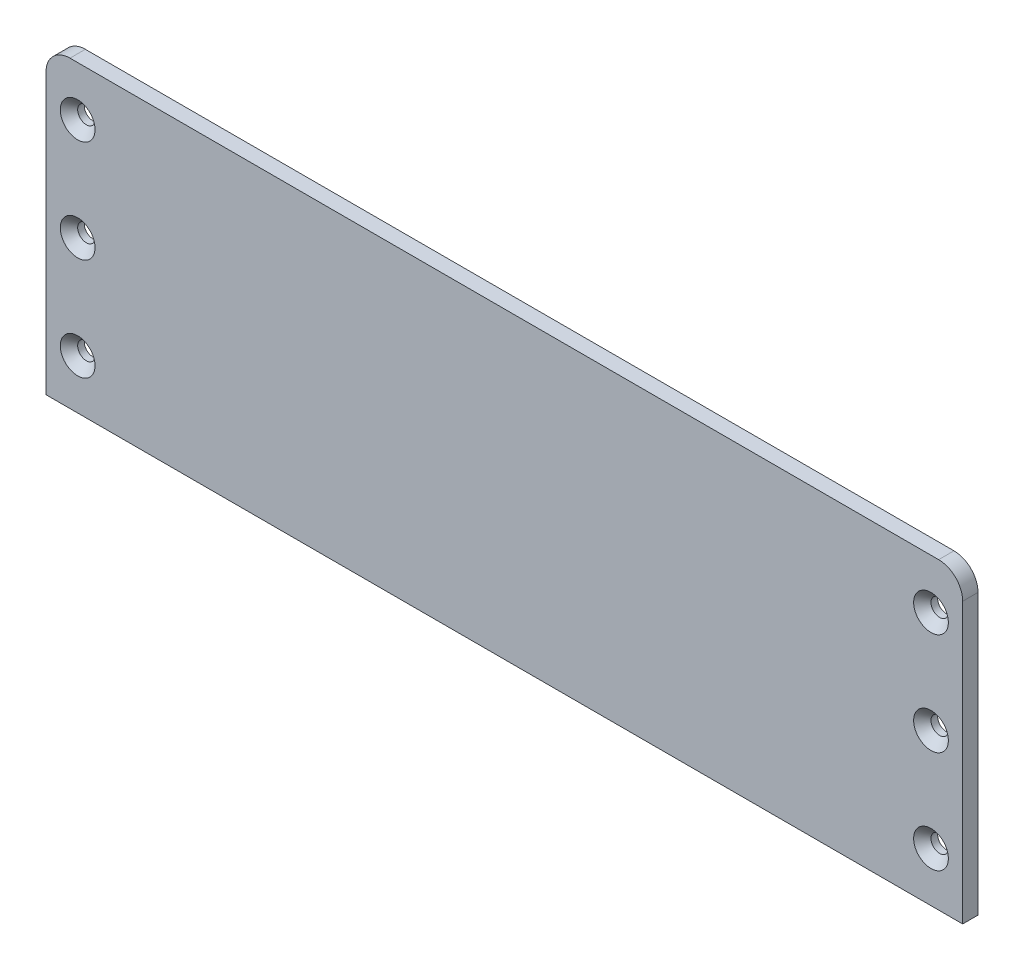
ISO-10303-21;
HEADER;
FILE_DESCRIPTION(('STEP AP214'),'2;1');
FILE_NAME('part.step','',(''),(''),'','','');
FILE_SCHEMA(('AUTOMOTIVE_DESIGN { 1 0 10303 214 1 1 1 1 }'));
ENDSEC;
DATA;
#1=APPLICATION_CONTEXT('core data for automotive mechanical design processes');
#2=APPLICATION_PROTOCOL_DEFINITION('international standard','automotive_design',2000,#1);
#3=PRODUCT_CONTEXT('',#1,'mechanical');
#4=PRODUCT('Part','Part','',(#3));
#5=PRODUCT_RELATED_PRODUCT_CATEGORY('part','',(#4));
#6=PRODUCT_DEFINITION_FORMATION('','',#4);
#7=PRODUCT_DEFINITION_CONTEXT('part definition',#1,'design');
#8=PRODUCT_DEFINITION('design','',#6,#7);
#9=PRODUCT_DEFINITION_SHAPE('','',#8);
#10=(LENGTH_UNIT() NAMED_UNIT(*) SI_UNIT(.MILLI.,.METRE.));
#11=(NAMED_UNIT(*) PLANE_ANGLE_UNIT() SI_UNIT($,.RADIAN.));
#12=(NAMED_UNIT(*) SI_UNIT($,.STERADIAN.) SOLID_ANGLE_UNIT());
#13=UNCERTAINTY_MEASURE_WITH_UNIT(LENGTH_MEASURE(1.E-05),#10,'distance_accuracy_value','');
#14=(GEOMETRIC_REPRESENTATION_CONTEXT(3) GLOBAL_UNCERTAINTY_ASSIGNED_CONTEXT((#13)) GLOBAL_UNIT_ASSIGNED_CONTEXT((#10,
#11,#12)) REPRESENTATION_CONTEXT('',''));
#15=CARTESIAN_POINT('',(0.,0.,0.));
#16=DIRECTION('',(0.,0.,1.));
#17=DIRECTION('',(1.,0.,0.));
#18=AXIS2_PLACEMENT_3D('',#15,#16,#17);
#19=CARTESIAN_POINT('',(0.,0.,3.));
#20=DIRECTION('',(0.,0.,-1.));
#21=DIRECTION('',(-1.,0.,0.));
#22=AXIS2_PLACEMENT_3D('',#19,#20,#21);
#23=PLANE('',#22);
#24=CARTESIAN_POINT('',(83.5,-20.,3.));
#25=DIRECTION('',(0.,0.,1.));
#26=DIRECTION('',(1.,0.,0.));
#27=AXIS2_PLACEMENT_3D('',#24,#25,#26);
#28=CIRCLE('',#27,3.4);
#29=CARTESIAN_POINT('',(86.9,-20.,3.));
#30=VERTEX_POINT('',#29);
#31=EDGE_CURVE('E189',#30,#30,#28,.T.);
#32=ORIENTED_EDGE('',*,*,#31,.F.);
#33=EDGE_LOOP('',(#32));
#34=FACE_BOUND('',#33,.T.);
#35=CARTESIAN_POINT('',(83.5,0.,3.));
#36=DIRECTION('',(0.,0.,1.));
#37=DIRECTION('',(1.,0.,0.));
#38=AXIS2_PLACEMENT_3D('',#35,#36,#37);
#39=CIRCLE('',#38,3.4);
#40=CARTESIAN_POINT('',(86.9,0.,3.));
#41=VERTEX_POINT('',#40);
#42=EDGE_CURVE('E180',#41,#41,#39,.T.);
#43=ORIENTED_EDGE('',*,*,#42,.F.);
#44=EDGE_LOOP('',(#43));
#45=FACE_BOUND('',#44,.T.);
#46=CARTESIAN_POINT('',(83.5,20.,3.));
#47=DIRECTION('',(0.,0.,1.));
#48=DIRECTION('',(1.,0.,0.));
#49=AXIS2_PLACEMENT_3D('',#46,#47,#48);
#50=CIRCLE('',#49,3.4);
#51=CARTESIAN_POINT('',(86.9,20.,3.));
#52=VERTEX_POINT('',#51);
#53=EDGE_CURVE('E171',#52,#52,#50,.T.);
#54=ORIENTED_EDGE('',*,*,#53,.F.);
#55=EDGE_LOOP('',(#54));
#56=FACE_BOUND('',#55,.T.);
#57=CARTESIAN_POINT('',(-83.5,-20.,3.));
#58=DIRECTION('',(0.,0.,1.));
#59=DIRECTION('',(1.,0.,0.));
#60=AXIS2_PLACEMENT_3D('',#57,#58,#59);
#61=CIRCLE('',#60,3.4);
#62=CARTESIAN_POINT('',(-80.1,-20.,3.));
#63=VERTEX_POINT('',#62);
#64=EDGE_CURVE('E162',#63,#63,#61,.T.);
#65=ORIENTED_EDGE('',*,*,#64,.F.);
#66=EDGE_LOOP('',(#65));
#67=FACE_BOUND('',#66,.T.);
#68=CARTESIAN_POINT('',(-83.5,0.,3.));
#69=DIRECTION('',(0.,0.,1.));
#70=DIRECTION('',(1.,0.,0.));
#71=AXIS2_PLACEMENT_3D('',#68,#69,#70);
#72=CIRCLE('',#71,3.4);
#73=CARTESIAN_POINT('',(-80.1,0.,3.));
#74=VERTEX_POINT('',#73);
#75=EDGE_CURVE('E153',#74,#74,#72,.T.);
#76=ORIENTED_EDGE('',*,*,#75,.F.);
#77=EDGE_LOOP('',(#76));
#78=FACE_BOUND('',#77,.T.);
#79=CARTESIAN_POINT('',(-83.5,20.,3.));
#80=DIRECTION('',(0.,0.,1.));
#81=DIRECTION('',(1.,0.,0.));
#82=AXIS2_PLACEMENT_3D('',#79,#80,#81);
#83=CIRCLE('',#82,3.4);
#84=CARTESIAN_POINT('',(-80.1,20.,3.));
#85=VERTEX_POINT('',#84);
#86=EDGE_CURVE('E107',#85,#85,#83,.T.);
#87=ORIENTED_EDGE('',*,*,#86,.F.);
#88=EDGE_LOOP('',(#87));
#89=FACE_BOUND('',#88,.T.);
#90=CARTESIAN_POINT('',(85.,25.,3.));
#91=DIRECTION('',(0.,0.,1.));
#92=DIRECTION('',(1.,0.,0.));
#93=AXIS2_PLACEMENT_3D('',#90,#91,#92);
#94=CIRCLE('',#93,4.7);
#95=CARTESIAN_POINT('',(89.7,25.,3.));
#96=VERTEX_POINT('',#95);
#97=CARTESIAN_POINT('',(84.9999999999999,29.7,3.));
#98=VERTEX_POINT('',#97);
#99=EDGE_CURVE('E123',#96,#98,#94,.T.);
#100=ORIENTED_EDGE('',*,*,#99,.T.);
#101=DIRECTION('',(-1.,0.,0.));
#102=VECTOR('',#101,1.);
#103=CARTESIAN_POINT('',(84.9999999999999,29.7,3.));
#104=LINE('',#103,#102);
#105=CARTESIAN_POINT('',(-85.,29.7,3.));
#106=VERTEX_POINT('',#105);
#107=EDGE_CURVE('E126',#98,#106,#104,.T.);
#108=ORIENTED_EDGE('',*,*,#107,.T.);
#109=CARTESIAN_POINT('',(-85.,25.,3.));
#110=DIRECTION('',(0.,0.,1.));
#111=DIRECTION('',(1.,0.,0.));
#112=AXIS2_PLACEMENT_3D('',#109,#110,#111);
#113=CIRCLE('',#112,4.69999999999999);
#114=CARTESIAN_POINT('',(-89.7,25.,3.));
#115=VERTEX_POINT('',#114);
#116=EDGE_CURVE('E55',#106,#115,#113,.T.);
#117=ORIENTED_EDGE('',*,*,#116,.T.);
#118=DIRECTION('',(0.,-1.,0.));
#119=VECTOR('',#118,1.);
#120=CARTESIAN_POINT('',(-89.7,25.,3.));
#121=LINE('',#120,#119);
#122=CARTESIAN_POINT('',(-89.7,-29.7,3.));
#123=VERTEX_POINT('',#122);
#124=EDGE_CURVE('E129',#115,#123,#121,.T.);
#125=ORIENTED_EDGE('',*,*,#124,.T.);
#126=DIRECTION('',(1.,0.,0.));
#127=VECTOR('',#126,1.);
#128=CARTESIAN_POINT('',(-89.7,-29.7,3.));
#129=LINE('',#128,#127);
#130=CARTESIAN_POINT('',(89.7,-29.7,3.));
#131=VERTEX_POINT('',#130);
#132=EDGE_CURVE('E132',#123,#131,#129,.T.);
#133=ORIENTED_EDGE('',*,*,#132,.T.);
#134=DIRECTION('',(0.,1.,0.));
#135=VECTOR('',#134,1.);
#136=CARTESIAN_POINT('',(89.7,-29.7,3.));
#137=LINE('',#136,#135);
#138=EDGE_CURVE('E135',#131,#96,#137,.T.);
#139=ORIENTED_EDGE('',*,*,#138,.T.);
#140=EDGE_LOOP('',(#100,#108,#117,#125,#133,#139));
#141=FACE_BOUND('',#140,.T.);
#142=ADVANCED_FACE('F40',(#34,#45,#56,#67,#78,#89,#141),#23,.F.);
#143=CARTESIAN_POINT('',(0.,0.,0.));
#144=DIRECTION('',(0.,0.,-1.));
#145=DIRECTION('',(-1.,0.,0.));
#146=AXIS2_PLACEMENT_3D('',#143,#144,#145);
#147=PLANE('',#146);
#148=CARTESIAN_POINT('',(83.5,-20.,0.));
#149=DIRECTION('',(0.,0.,1.));
#150=DIRECTION('',(1.,0.,0.));
#151=AXIS2_PLACEMENT_3D('',#148,#149,#150);
#152=CIRCLE('',#151,1.69999999999999);
#153=CARTESIAN_POINT('',(85.2,-20.,0.));
#154=VERTEX_POINT('',#153);
#155=EDGE_CURVE('E11',#154,#154,#152,.T.);
#156=ORIENTED_EDGE('',*,*,#155,.T.);
#157=EDGE_LOOP('',(#156));
#158=FACE_BOUND('',#157,.T.);
#159=CARTESIAN_POINT('',(83.5,0.,0.));
#160=DIRECTION('',(0.,0.,1.));
#161=DIRECTION('',(1.,0.,0.));
#162=AXIS2_PLACEMENT_3D('',#159,#160,#161);
#163=CIRCLE('',#162,1.69999999999999);
#164=CARTESIAN_POINT('',(85.2,0.,0.));
#165=VERTEX_POINT('',#164);
#166=EDGE_CURVE('E186',#165,#165,#163,.T.);
#167=ORIENTED_EDGE('',*,*,#166,.T.);
#168=EDGE_LOOP('',(#167));
#169=FACE_BOUND('',#168,.T.);
#170=CARTESIAN_POINT('',(83.5,20.,0.));
#171=DIRECTION('',(0.,0.,1.));
#172=DIRECTION('',(1.,0.,0.));
#173=AXIS2_PLACEMENT_3D('',#170,#171,#172);
#174=CIRCLE('',#173,1.69999999999999);
#175=CARTESIAN_POINT('',(85.2,20.,0.));
#176=VERTEX_POINT('',#175);
#177=EDGE_CURVE('E177',#176,#176,#174,.T.);
#178=ORIENTED_EDGE('',*,*,#177,.T.);
#179=EDGE_LOOP('',(#178));
#180=FACE_BOUND('',#179,.T.);
#181=CARTESIAN_POINT('',(-83.5,-20.,0.));
#182=DIRECTION('',(0.,0.,1.));
#183=DIRECTION('',(1.,0.,0.));
#184=AXIS2_PLACEMENT_3D('',#181,#182,#183);
#185=CIRCLE('',#184,1.69999999999999);
#186=CARTESIAN_POINT('',(-81.8,-20.,0.));
#187=VERTEX_POINT('',#186);
#188=EDGE_CURVE('E168',#187,#187,#185,.T.);
#189=ORIENTED_EDGE('',*,*,#188,.T.);
#190=EDGE_LOOP('',(#189));
#191=FACE_BOUND('',#190,.T.);
#192=CARTESIAN_POINT('',(-83.5,0.,0.));
#193=DIRECTION('',(0.,0.,1.));
#194=DIRECTION('',(1.,0.,0.));
#195=AXIS2_PLACEMENT_3D('',#192,#193,#194);
#196=CIRCLE('',#195,1.69999999999999);
#197=CARTESIAN_POINT('',(-81.8,0.,0.));
#198=VERTEX_POINT('',#197);
#199=EDGE_CURVE('E159',#198,#198,#196,.T.);
#200=ORIENTED_EDGE('',*,*,#199,.T.);
#201=EDGE_LOOP('',(#200));
#202=FACE_BOUND('',#201,.T.);
#203=CARTESIAN_POINT('',(-83.5,20.,0.));
#204=DIRECTION('',(0.,0.,1.));
#205=DIRECTION('',(1.,0.,0.));
#206=AXIS2_PLACEMENT_3D('',#203,#204,#205);
#207=CIRCLE('',#206,1.69999999999999);
#208=CARTESIAN_POINT('',(-81.8,20.,0.));
#209=VERTEX_POINT('',#208);
#210=EDGE_CURVE('E150',#209,#209,#207,.T.);
#211=ORIENTED_EDGE('',*,*,#210,.T.);
#212=EDGE_LOOP('',(#211));
#213=FACE_BOUND('',#212,.T.);
#214=DIRECTION('',(-1.,0.,0.));
#215=VECTOR('',#214,1.);
#216=CARTESIAN_POINT('',(84.9999999999999,29.7,0.));
#217=LINE('',#216,#215);
#218=CARTESIAN_POINT('',(84.9999999999999,29.7,0.));
#219=VERTEX_POINT('',#218);
#220=CARTESIAN_POINT('',(-85.,29.7,0.));
#221=VERTEX_POINT('',#220);
#222=EDGE_CURVE('E104',#219,#221,#217,.T.);
#223=ORIENTED_EDGE('',*,*,#222,.F.);
#224=CARTESIAN_POINT('',(85.,25.,0.));
#225=DIRECTION('',(0.,0.,-1.));
#226=DIRECTION('',(-1.,0.,0.));
#227=AXIS2_PLACEMENT_3D('',#224,#225,#226);
#228=CIRCLE('',#227,4.7);
#229=CARTESIAN_POINT('',(89.7,25.,0.));
#230=VERTEX_POINT('',#229);
#231=EDGE_CURVE('E63',#230,#219,#228,.F.);
#232=ORIENTED_EDGE('',*,*,#231,.F.);
#233=DIRECTION('',(0.,1.,0.));
#234=VECTOR('',#233,1.);
#235=CARTESIAN_POINT('',(89.7,-29.7,0.));
#236=LINE('',#235,#234);
#237=CARTESIAN_POINT('',(89.7,-29.7,0.));
#238=VERTEX_POINT('',#237);
#239=EDGE_CURVE('E119',#238,#230,#236,.T.);
#240=ORIENTED_EDGE('',*,*,#239,.F.);
#241=DIRECTION('',(1.,0.,0.));
#242=VECTOR('',#241,1.);
#243=CARTESIAN_POINT('',(-89.7,-29.7,0.));
#244=LINE('',#243,#242);
#245=CARTESIAN_POINT('',(-89.7,-29.7,0.));
#246=VERTEX_POINT('',#245);
#247=EDGE_CURVE('E114',#246,#238,#244,.T.);
#248=ORIENTED_EDGE('',*,*,#247,.F.);
#249=DIRECTION('',(0.,-1.,0.));
#250=VECTOR('',#249,1.);
#251=CARTESIAN_POINT('',(-89.7,25.,0.));
#252=LINE('',#251,#250);
#253=CARTESIAN_POINT('',(-89.7,25.,0.));
#254=VERTEX_POINT('',#253);
#255=EDGE_CURVE('E112',#254,#246,#252,.T.);
#256=ORIENTED_EDGE('',*,*,#255,.F.);
#257=CARTESIAN_POINT('',(-85.,25.,0.));
#258=DIRECTION('',(0.,0.,-1.));
#259=DIRECTION('',(-1.,0.,0.));
#260=AXIS2_PLACEMENT_3D('',#257,#258,#259);
#261=CIRCLE('',#260,4.69999999999999);
#262=EDGE_CURVE('E95',#221,#254,#261,.F.);
#263=ORIENTED_EDGE('',*,*,#262,.F.);
#264=EDGE_LOOP('',(#223,#232,#240,#248,#256,#263));
#265=FACE_BOUND('',#264,.T.);
#266=ADVANCED_FACE('F42',(#158,#169,#180,#191,#202,#213,#265),#147,.T.);
#267=CARTESIAN_POINT('',(83.5,-20.,3.));
#268=DIRECTION('',(0.,0.,1.));
#269=DIRECTION('',(1.,0.,0.));
#270=AXIS2_PLACEMENT_3D('',#267,#268,#269);
#271=CYLINDRICAL_SURFACE('',#270,1.69999999999999);
#272=ORIENTED_EDGE('',*,*,#155,.F.);
#273=EDGE_LOOP('',(#272));
#274=FACE_BOUND('',#273,.T.);
#275=CARTESIAN_POINT('',(83.5,-20.,1.3));
#276=DIRECTION('',(0.,0.,1.));
#277=DIRECTION('',(1.,0.,0.));
#278=AXIS2_PLACEMENT_3D('',#275,#276,#277);
#279=CIRCLE('',#278,1.69999999999999);
#280=CARTESIAN_POINT('',(85.2,-20.,1.3));
#281=VERTEX_POINT('',#280);
#282=EDGE_CURVE('E48',#281,#281,#279,.T.);
#283=ORIENTED_EDGE('',*,*,#282,.T.);
#284=EDGE_LOOP('',(#283));
#285=FACE_BOUND('',#284,.T.);
#286=ADVANCED_FACE('F194',(#274,#285),#271,.F.);
#287=CARTESIAN_POINT('',(83.5,-20.,3.));
#288=DIRECTION('',(0.,0.,1.));
#289=DIRECTION('',(1.,0.,0.));
#290=AXIS2_PLACEMENT_3D('',#287,#288,#289);
#291=CONICAL_SURFACE('',#290,3.4,0.78539816339745);
#292=ORIENTED_EDGE('',*,*,#282,.F.);
#293=EDGE_LOOP('',(#292));
#294=FACE_BOUND('',#293,.T.);
#295=ORIENTED_EDGE('',*,*,#31,.T.);
#296=EDGE_LOOP('',(#295));
#297=FACE_BOUND('',#296,.T.);
#298=ADVANCED_FACE('F196',(#294,#297),#291,.F.);
#299=CARTESIAN_POINT('',(83.5,0.,3.));
#300=DIRECTION('',(0.,0.,1.));
#301=DIRECTION('',(1.,0.,0.));
#302=AXIS2_PLACEMENT_3D('',#299,#300,#301);
#303=CYLINDRICAL_SURFACE('',#302,1.69999999999999);
#304=ORIENTED_EDGE('',*,*,#166,.F.);
#305=EDGE_LOOP('',(#304));
#306=FACE_BOUND('',#305,.T.);
#307=CARTESIAN_POINT('',(83.5,0.,1.3));
#308=DIRECTION('',(0.,0.,1.));
#309=DIRECTION('',(1.,0.,0.));
#310=AXIS2_PLACEMENT_3D('',#307,#308,#309);
#311=CIRCLE('',#310,1.69999999999999);
#312=CARTESIAN_POINT('',(85.2,0.,1.3));
#313=VERTEX_POINT('',#312);
#314=EDGE_CURVE('E183',#313,#313,#311,.T.);
#315=ORIENTED_EDGE('',*,*,#314,.T.);
#316=EDGE_LOOP('',(#315));
#317=FACE_BOUND('',#316,.T.);
#318=ADVANCED_FACE('F199',(#306,#317),#303,.F.);
#319=CARTESIAN_POINT('',(83.5,0.,3.));
#320=DIRECTION('',(0.,0.,1.));
#321=DIRECTION('',(1.,0.,0.));
#322=AXIS2_PLACEMENT_3D('',#319,#320,#321);
#323=CONICAL_SURFACE('',#322,3.4,0.78539816339745);
#324=ORIENTED_EDGE('',*,*,#314,.F.);
#325=EDGE_LOOP('',(#324));
#326=FACE_BOUND('',#325,.T.);
#327=ORIENTED_EDGE('',*,*,#42,.T.);
#328=EDGE_LOOP('',(#327));
#329=FACE_BOUND('',#328,.T.);
#330=ADVANCED_FACE('F272',(#326,#329),#323,.F.);
#331=CARTESIAN_POINT('',(83.5,20.,3.));
#332=DIRECTION('',(0.,0.,1.));
#333=DIRECTION('',(1.,0.,0.));
#334=AXIS2_PLACEMENT_3D('',#331,#332,#333);
#335=CYLINDRICAL_SURFACE('',#334,1.69999999999999);
#336=ORIENTED_EDGE('',*,*,#177,.F.);
#337=EDGE_LOOP('',(#336));
#338=FACE_BOUND('',#337,.T.);
#339=CARTESIAN_POINT('',(83.5,20.,1.3));
#340=DIRECTION('',(0.,0.,1.));
#341=DIRECTION('',(1.,0.,0.));
#342=AXIS2_PLACEMENT_3D('',#339,#340,#341);
#343=CIRCLE('',#342,1.69999999999999);
#344=CARTESIAN_POINT('',(85.2,20.,1.3));
#345=VERTEX_POINT('',#344);
#346=EDGE_CURVE('E174',#345,#345,#343,.T.);
#347=ORIENTED_EDGE('',*,*,#346,.T.);
#348=EDGE_LOOP('',(#347));
#349=FACE_BOUND('',#348,.T.);
#350=ADVANCED_FACE('F268',(#338,#349),#335,.F.);
#351=CARTESIAN_POINT('',(83.5,20.,3.));
#352=DIRECTION('',(0.,0.,1.));
#353=DIRECTION('',(1.,0.,0.));
#354=AXIS2_PLACEMENT_3D('',#351,#352,#353);
#355=CONICAL_SURFACE('',#354,3.4,0.78539816339745);
#356=ORIENTED_EDGE('',*,*,#346,.F.);
#357=EDGE_LOOP('',(#356));
#358=FACE_BOUND('',#357,.T.);
#359=ORIENTED_EDGE('',*,*,#53,.T.);
#360=EDGE_LOOP('',(#359));
#361=FACE_BOUND('',#360,.T.);
#362=ADVANCED_FACE('F264',(#358,#361),#355,.F.);
#363=CARTESIAN_POINT('',(-83.5,-20.,3.));
#364=DIRECTION('',(0.,0.,1.));
#365=DIRECTION('',(1.,0.,0.));
#366=AXIS2_PLACEMENT_3D('',#363,#364,#365);
#367=CYLINDRICAL_SURFACE('',#366,1.69999999999999);
#368=ORIENTED_EDGE('',*,*,#188,.F.);
#369=EDGE_LOOP('',(#368));
#370=FACE_BOUND('',#369,.T.);
#371=CARTESIAN_POINT('',(-83.5,-20.,1.3));
#372=DIRECTION('',(0.,0.,1.));
#373=DIRECTION('',(1.,0.,0.));
#374=AXIS2_PLACEMENT_3D('',#371,#372,#373);
#375=CIRCLE('',#374,1.69999999999999);
#376=CARTESIAN_POINT('',(-81.8,-20.,1.3));
#377=VERTEX_POINT('',#376);
#378=EDGE_CURVE('E165',#377,#377,#375,.T.);
#379=ORIENTED_EDGE('',*,*,#378,.T.);
#380=EDGE_LOOP('',(#379));
#381=FACE_BOUND('',#380,.T.);
#382=ADVANCED_FACE('F260',(#370,#381),#367,.F.);
#383=CARTESIAN_POINT('',(-83.5,-20.,3.));
#384=DIRECTION('',(0.,0.,1.));
#385=DIRECTION('',(1.,0.,0.));
#386=AXIS2_PLACEMENT_3D('',#383,#384,#385);
#387=CONICAL_SURFACE('',#386,3.4,0.78539816339745);
#388=ORIENTED_EDGE('',*,*,#378,.F.);
#389=EDGE_LOOP('',(#388));
#390=FACE_BOUND('',#389,.T.);
#391=ORIENTED_EDGE('',*,*,#64,.T.);
#392=EDGE_LOOP('',(#391));
#393=FACE_BOUND('',#392,.T.);
#394=ADVANCED_FACE('F256',(#390,#393),#387,.F.);
#395=CARTESIAN_POINT('',(-83.5,0.,3.));
#396=DIRECTION('',(0.,0.,1.));
#397=DIRECTION('',(1.,0.,0.));
#398=AXIS2_PLACEMENT_3D('',#395,#396,#397);
#399=CYLINDRICAL_SURFACE('',#398,1.69999999999999);
#400=ORIENTED_EDGE('',*,*,#199,.F.);
#401=EDGE_LOOP('',(#400));
#402=FACE_BOUND('',#401,.T.);
#403=CARTESIAN_POINT('',(-83.5,0.,1.3));
#404=DIRECTION('',(0.,0.,1.));
#405=DIRECTION('',(1.,0.,0.));
#406=AXIS2_PLACEMENT_3D('',#403,#404,#405);
#407=CIRCLE('',#406,1.69999999999999);
#408=CARTESIAN_POINT('',(-81.8,0.,1.3));
#409=VERTEX_POINT('',#408);
#410=EDGE_CURVE('E156',#409,#409,#407,.T.);
#411=ORIENTED_EDGE('',*,*,#410,.T.);
#412=EDGE_LOOP('',(#411));
#413=FACE_BOUND('',#412,.T.);
#414=ADVANCED_FACE('F252',(#402,#413),#399,.F.);
#415=CARTESIAN_POINT('',(-83.5,0.,3.));
#416=DIRECTION('',(0.,0.,1.));
#417=DIRECTION('',(1.,0.,0.));
#418=AXIS2_PLACEMENT_3D('',#415,#416,#417);
#419=CONICAL_SURFACE('',#418,3.4,0.78539816339745);
#420=ORIENTED_EDGE('',*,*,#410,.F.);
#421=EDGE_LOOP('',(#420));
#422=FACE_BOUND('',#421,.T.);
#423=ORIENTED_EDGE('',*,*,#75,.T.);
#424=EDGE_LOOP('',(#423));
#425=FACE_BOUND('',#424,.T.);
#426=ADVANCED_FACE('F248',(#422,#425),#419,.F.);
#427=CARTESIAN_POINT('',(-83.5,20.,3.));
#428=DIRECTION('',(0.,0.,1.));
#429=DIRECTION('',(1.,0.,0.));
#430=AXIS2_PLACEMENT_3D('',#427,#428,#429);
#431=CYLINDRICAL_SURFACE('',#430,1.69999999999999);
#432=ORIENTED_EDGE('',*,*,#210,.F.);
#433=EDGE_LOOP('',(#432));
#434=FACE_BOUND('',#433,.T.);
#435=CARTESIAN_POINT('',(-83.5,20.,1.3));
#436=DIRECTION('',(0.,0.,1.));
#437=DIRECTION('',(1.,0.,0.));
#438=AXIS2_PLACEMENT_3D('',#435,#436,#437);
#439=CIRCLE('',#438,1.69999999999999);
#440=CARTESIAN_POINT('',(-81.8,20.,1.3));
#441=VERTEX_POINT('',#440);
#442=EDGE_CURVE('E147',#441,#441,#439,.T.);
#443=ORIENTED_EDGE('',*,*,#442,.T.);
#444=EDGE_LOOP('',(#443));
#445=FACE_BOUND('',#444,.T.);
#446=ADVANCED_FACE('F244',(#434,#445),#431,.F.);
#447=CARTESIAN_POINT('',(-83.5,20.,3.));
#448=DIRECTION('',(0.,0.,1.));
#449=DIRECTION('',(1.,0.,0.));
#450=AXIS2_PLACEMENT_3D('',#447,#448,#449);
#451=CONICAL_SURFACE('',#450,3.4,0.78539816339745);
#452=ORIENTED_EDGE('',*,*,#442,.F.);
#453=EDGE_LOOP('',(#452));
#454=FACE_BOUND('',#453,.T.);
#455=ORIENTED_EDGE('',*,*,#86,.T.);
#456=EDGE_LOOP('',(#455));
#457=FACE_BOUND('',#456,.T.);
#458=ADVANCED_FACE('F241',(#454,#457),#451,.F.);
#459=CARTESIAN_POINT('',(85.,25.,-0.00100000000000013));
#460=DIRECTION('',(0.,0.,1.));
#461=DIRECTION('',(1.,0.,0.));
#462=AXIS2_PLACEMENT_3D('',#459,#460,#461);
#463=CYLINDRICAL_SURFACE('',#462,4.7);
#464=ORIENTED_EDGE('',*,*,#231,.T.);
#465=DIRECTION('',(0.,0.,1.));
#466=VECTOR('',#465,1.);
#467=CARTESIAN_POINT('',(84.9999999999999,29.7,-0.00100000000000013));
#468=LINE('',#467,#466);
#469=EDGE_CURVE('E101',#219,#98,#468,.T.);
#470=ORIENTED_EDGE('',*,*,#469,.T.);
#471=ORIENTED_EDGE('',*,*,#99,.F.);
#472=DIRECTION('',(0.,0.,1.));
#473=VECTOR('',#472,1.);
#474=CARTESIAN_POINT('',(89.7,25.,-0.00100000000000013));
#475=LINE('',#474,#473);
#476=EDGE_CURVE('E108',#230,#96,#475,.T.);
#477=ORIENTED_EDGE('',*,*,#476,.F.);
#478=EDGE_LOOP('',(#464,#470,#471,#477));
#479=FACE_BOUND('',#478,.T.);
#480=ADVANCED_FACE('F217',(#479),#463,.T.);
#481=CARTESIAN_POINT('',(89.7,-29.7,-0.00100000000000013));
#482=DIRECTION('',(1.,0.,0.));
#483=DIRECTION('',(0.,0.,-1.));
#484=AXIS2_PLACEMENT_3D('',#481,#482,#483);
#485=PLANE('',#484);
#486=ORIENTED_EDGE('',*,*,#239,.T.);
#487=ORIENTED_EDGE('',*,*,#476,.T.);
#488=ORIENTED_EDGE('',*,*,#138,.F.);
#489=DIRECTION('',(0.,0.,1.));
#490=VECTOR('',#489,1.);
#491=CARTESIAN_POINT('',(89.7,-29.7,-0.00100000000000013));
#492=LINE('',#491,#490);
#493=EDGE_CURVE('E139',#238,#131,#492,.T.);
#494=ORIENTED_EDGE('',*,*,#493,.F.);
#495=EDGE_LOOP('',(#486,#487,#488,#494));
#496=FACE_BOUND('',#495,.T.);
#497=ADVANCED_FACE('F220',(#496),#485,.T.);
#498=CARTESIAN_POINT('',(-89.7,-29.7,-0.00100000000000013));
#499=DIRECTION('',(0.,-1.,0.));
#500=DIRECTION('',(1.,0.,0.));
#501=AXIS2_PLACEMENT_3D('',#498,#499,#500);
#502=PLANE('',#501);
#503=ORIENTED_EDGE('',*,*,#247,.T.);
#504=ORIENTED_EDGE('',*,*,#493,.T.);
#505=ORIENTED_EDGE('',*,*,#132,.F.);
#506=DIRECTION('',(0.,0.,1.));
#507=VECTOR('',#506,1.);
#508=CARTESIAN_POINT('',(-89.7,-29.7,-0.00100000000000013));
#509=LINE('',#508,#507);
#510=EDGE_CURVE('E141',#246,#123,#509,.T.);
#511=ORIENTED_EDGE('',*,*,#510,.F.);
#512=EDGE_LOOP('',(#503,#504,#505,#511));
#513=FACE_BOUND('',#512,.T.);
#514=ADVANCED_FACE('F222',(#513),#502,.T.);
#515=CARTESIAN_POINT('',(-89.7,25.,-0.00100000000000013));
#516=DIRECTION('',(-1.,0.,0.));
#517=DIRECTION('',(0.,0.,1.));
#518=AXIS2_PLACEMENT_3D('',#515,#516,#517);
#519=PLANE('',#518);
#520=ORIENTED_EDGE('',*,*,#255,.T.);
#521=ORIENTED_EDGE('',*,*,#510,.T.);
#522=ORIENTED_EDGE('',*,*,#124,.F.);
#523=DIRECTION('',(0.,0.,1.));
#524=VECTOR('',#523,1.);
#525=CARTESIAN_POINT('',(-89.7,25.,-0.00100000000000013));
#526=LINE('',#525,#524);
#527=EDGE_CURVE('E100',#254,#115,#526,.T.);
#528=ORIENTED_EDGE('',*,*,#527,.F.);
#529=EDGE_LOOP('',(#520,#521,#522,#528));
#530=FACE_BOUND('',#529,.T.);
#531=ADVANCED_FACE('F226',(#530),#519,.T.);
#532=CARTESIAN_POINT('',(-85.,25.,-0.00100000000000013));
#533=DIRECTION('',(0.,0.,1.));
#534=DIRECTION('',(1.,0.,0.));
#535=AXIS2_PLACEMENT_3D('',#532,#533,#534);
#536=CYLINDRICAL_SURFACE('',#535,4.69999999999999);
#537=ORIENTED_EDGE('',*,*,#262,.T.);
#538=ORIENTED_EDGE('',*,*,#527,.T.);
#539=ORIENTED_EDGE('',*,*,#116,.F.);
#540=DIRECTION('',(0.,0.,1.));
#541=VECTOR('',#540,1.);
#542=CARTESIAN_POINT('',(-85.,29.7,-0.00100000000000013));
#543=LINE('',#542,#541);
#544=EDGE_CURVE('E91',#221,#106,#543,.T.);
#545=ORIENTED_EDGE('',*,*,#544,.F.);
#546=EDGE_LOOP('',(#537,#538,#539,#545));
#547=FACE_BOUND('',#546,.T.);
#548=ADVANCED_FACE('F93',(#547),#536,.T.);
#549=CARTESIAN_POINT('',(84.9999999999999,29.7,-0.00100000000000013));
#550=DIRECTION('',(0.,1.,0.));
#551=DIRECTION('',(-1.,0.,0.));
#552=AXIS2_PLACEMENT_3D('',#549,#550,#551);
#553=PLANE('',#552);
#554=ORIENTED_EDGE('',*,*,#222,.T.);
#555=ORIENTED_EDGE('',*,*,#544,.T.);
#556=ORIENTED_EDGE('',*,*,#107,.F.);
#557=ORIENTED_EDGE('',*,*,#469,.F.);
#558=EDGE_LOOP('',(#554,#555,#556,#557));
#559=FACE_BOUND('',#558,.T.);
#560=ADVANCED_FACE('F105',(#559),#553,.T.);
#561=CLOSED_SHELL('',(#142,#266,#286,#298,#318,#330,#350,#362,#382,#394,#414,#426,#446,#458,
#480,#497,#514,#531,#548,#560));
#562=MANIFOLD_SOLID_BREP('B2',#561);
#563=ADVANCED_BREP_SHAPE_REPRESENTATION('',(#18,#562),#14);
#564=SHAPE_DEFINITION_REPRESENTATION(#9,#563);
ENDSEC;
END-ISO-10303-21;
